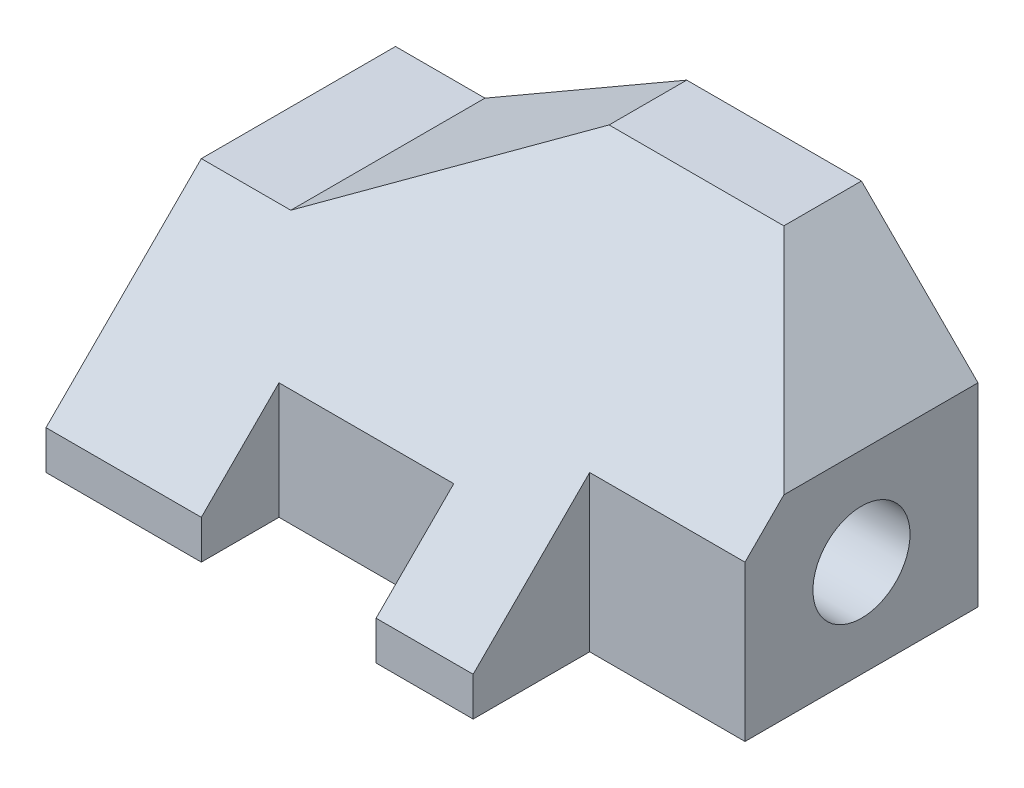
ISO-10303-21;
HEADER;
FILE_DESCRIPTION(('STEP AP214'),'2;1');
FILE_NAME('part.step','',(''),(''),'','','');
FILE_SCHEMA(('AUTOMOTIVE_DESIGN { 1 0 10303 214 1 1 1 1 }'));
ENDSEC;
DATA;
#1=APPLICATION_CONTEXT('core data for automotive mechanical design processes');
#2=APPLICATION_PROTOCOL_DEFINITION('international standard','automotive_design',2000,#1);
#3=PRODUCT_CONTEXT('',#1,'mechanical');
#4=PRODUCT('Part','Part','',(#3));
#5=PRODUCT_RELATED_PRODUCT_CATEGORY('part','',(#4));
#6=PRODUCT_DEFINITION_FORMATION('','',#4);
#7=PRODUCT_DEFINITION_CONTEXT('part definition',#1,'design');
#8=PRODUCT_DEFINITION('design','',#6,#7);
#9=PRODUCT_DEFINITION_SHAPE('','',#8);
#10=(LENGTH_UNIT() NAMED_UNIT(*) SI_UNIT(.MILLI.,.METRE.));
#11=(NAMED_UNIT(*) PLANE_ANGLE_UNIT() SI_UNIT($,.RADIAN.));
#12=(NAMED_UNIT(*) SI_UNIT($,.STERADIAN.) SOLID_ANGLE_UNIT());
#13=UNCERTAINTY_MEASURE_WITH_UNIT(LENGTH_MEASURE(1.E-05),#10,'distance_accuracy_value','');
#14=(GEOMETRIC_REPRESENTATION_CONTEXT(3) GLOBAL_UNCERTAINTY_ASSIGNED_CONTEXT((#13)) GLOBAL_UNIT_ASSIGNED_CONTEXT((#10,
#11,#12)) REPRESENTATION_CONTEXT('',''));
#15=CARTESIAN_POINT('',(0.,0.,0.));
#16=DIRECTION('',(0.,0.,1.));
#17=DIRECTION('',(1.,0.,0.));
#18=AXIS2_PLACEMENT_3D('',#15,#16,#17);
#19=CARTESIAN_POINT('',(0.,50.8,0.));
#20=DIRECTION('',(0.,0.,-1.));
#21=DIRECTION('',(-1.,0.,0.));
#22=AXIS2_PLACEMENT_3D('',#19,#20,#21);
#23=PLANE('',#22);
#24=DIRECTION('',(1.,0.,0.));
#25=VECTOR('',#24,1.);
#26=CARTESIAN_POINT('',(0.,0.,0.));
#27=LINE('',#26,#25);
#28=CARTESIAN_POINT('',(0.,0.,0.));
#29=VERTEX_POINT('',#28);
#30=CARTESIAN_POINT('',(25.4,0.,0.));
#31=VERTEX_POINT('',#30);
#32=EDGE_CURVE('E250',#29,#31,#27,.T.);
#33=ORIENTED_EDGE('',*,*,#32,.T.);
#34=DIRECTION('',(0.,-1.,0.));
#35=VECTOR('',#34,1.);
#36=CARTESIAN_POINT('',(25.4,50.8,0.));
#37=LINE('',#36,#35);
#38=CARTESIAN_POINT('',(25.4,6.35000000000045,0.));
#39=VERTEX_POINT('',#38);
#40=EDGE_CURVE('E194',#39,#31,#37,.T.);
#41=ORIENTED_EDGE('',*,*,#40,.F.);
#42=DIRECTION('',(1.,0.,0.));
#43=VECTOR('',#42,1.);
#44=CARTESIAN_POINT('',(0.,6.35000000000045,0.));
#45=LINE('',#44,#43);
#46=CARTESIAN_POINT('',(0.,6.35000000000045,0.));
#47=VERTEX_POINT('',#46);
#48=EDGE_CURVE('E236',#47,#39,#45,.T.);
#49=ORIENTED_EDGE('',*,*,#48,.F.);
#50=DIRECTION('',(0.,-1.,0.));
#51=VECTOR('',#50,1.);
#52=CARTESIAN_POINT('',(0.,50.8,0.));
#53=LINE('',#52,#51);
#54=EDGE_CURVE('E266',#47,#29,#53,.T.);
#55=ORIENTED_EDGE('',*,*,#54,.T.);
#56=EDGE_LOOP('',(#33,#41,#49,#55));
#57=FACE_BOUND('',#56,.T.);
#58=ADVANCED_FACE('F43',(#57),#23,.F.);
#59=CARTESIAN_POINT('',(0.,50.8,0.));
#60=DIRECTION('',(1.,0.,0.));
#61=DIRECTION('',(0.,0.,-1.));
#62=AXIS2_PLACEMENT_3D('',#59,#60,#61);
#63=PLANE('',#62);
#64=DIRECTION('',(0.,0.707106781186544,-0.707106781186551));
#65=VECTOR('',#64,1.);
#66=CARTESIAN_POINT('',(0.,50.8,-44.45));
#67=LINE('',#66,#65);
#68=CARTESIAN_POINT('',(0.,31.75,-25.3999999999998));
#69=VERTEX_POINT('',#68);
#70=EDGE_CURVE('E225',#47,#69,#67,.T.);
#71=ORIENTED_EDGE('',*,*,#70,.T.);
#72=DIRECTION('',(0.,0.,-1.));
#73=VECTOR('',#72,1.);
#74=CARTESIAN_POINT('',(0.,31.75,0.));
#75=LINE('',#74,#73);
#76=CARTESIAN_POINT('',(0.,31.75,-57.15));
#77=VERTEX_POINT('',#76);
#78=EDGE_CURVE('E174',#69,#77,#75,.T.);
#79=ORIENTED_EDGE('',*,*,#78,.T.);
#80=DIRECTION('',(0.,-1.,0.));
#81=VECTOR('',#80,1.);
#82=CARTESIAN_POINT('',(0.,50.8,-57.15));
#83=LINE('',#82,#81);
#84=CARTESIAN_POINT('',(0.,0.,-57.15));
#85=VERTEX_POINT('',#84);
#86=EDGE_CURVE('E244',#77,#85,#83,.T.);
#87=ORIENTED_EDGE('',*,*,#86,.T.);
#88=DIRECTION('',(0.,0.,1.));
#89=VECTOR('',#88,1.);
#90=CARTESIAN_POINT('',(0.,0.,0.));
#91=LINE('',#90,#89);
#92=EDGE_CURVE('E235',#85,#29,#91,.T.);
#93=ORIENTED_EDGE('',*,*,#92,.T.);
#94=ORIENTED_EDGE('',*,*,#54,.F.);
#95=EDGE_LOOP('',(#71,#79,#87,#93,#94));
#96=FACE_BOUND('',#95,.T.);
#97=ADVANCED_FACE('F321',(#96),#63,.F.);
#98=CARTESIAN_POINT('',(53.975,6.35000000000045,0.));
#99=VERTEX_POINT('',#98);
#100=CARTESIAN_POINT('',(69.85,6.35000000000045,0.));
#101=VERTEX_POINT('',#100);
#102=EDGE_CURVE('E229',#99,#101,#45,.T.);
#103=ORIENTED_EDGE('',*,*,#102,.F.);
#104=DIRECTION('',(0.,-1.,0.));
#105=VECTOR('',#104,1.);
#106=CARTESIAN_POINT('',(53.975,50.8,0.));
#107=LINE('',#106,#105);
#108=CARTESIAN_POINT('',(53.975,0.,0.));
#109=VERTEX_POINT('',#108);
#110=EDGE_CURVE('E198',#99,#109,#107,.T.);
#111=ORIENTED_EDGE('',*,*,#110,.T.);
#112=CARTESIAN_POINT('',(69.85,0.,0.));
#113=VERTEX_POINT('',#112);
#114=EDGE_CURVE('E249',#109,#113,#27,.T.);
#115=ORIENTED_EDGE('',*,*,#114,.T.);
#116=DIRECTION('',(0.,-1.,0.));
#117=VECTOR('',#116,1.);
#118=CARTESIAN_POINT('',(69.85,50.8,0.));
#119=LINE('',#118,#117);
#120=EDGE_CURVE('E214',#101,#113,#119,.T.);
#121=ORIENTED_EDGE('',*,*,#120,.F.);
#122=EDGE_LOOP('',(#103,#111,#115,#121));
#123=FACE_BOUND('',#122,.T.);
#124=ADVANCED_FACE('F345',(#123),#23,.F.);
#125=CARTESIAN_POINT('',(95.25,50.8,0.));
#126=DIRECTION('',(-1.,0.,0.));
#127=DIRECTION('',(0.,0.,1.));
#128=AXIS2_PLACEMENT_3D('',#125,#126,#127);
#129=PLANE('',#128);
#130=CARTESIAN_POINT('',(95.25,15.875,-38.1));
#131=DIRECTION('',(1.,0.,0.));
#132=DIRECTION('',(0.,0.,-1.));
#133=AXIS2_PLACEMENT_3D('',#130,#131,#132);
#134=CIRCLE('',#133,7.9375);
#135=CARTESIAN_POINT('',(95.25,15.875,-46.0375));
#136=VERTEX_POINT('',#135);
#137=EDGE_CURVE('E160',#136,#136,#134,.T.);
#138=ORIENTED_EDGE('',*,*,#137,.F.);
#139=EDGE_LOOP('',(#138));
#140=FACE_BOUND('',#139,.T.);
#141=DIRECTION('',(0.,-1.,0.));
#142=VECTOR('',#141,1.);
#143=CARTESIAN_POINT('',(95.25,50.8,-57.15));
#144=LINE('',#143,#142);
#145=CARTESIAN_POINT('',(95.25,31.7499999999999,-57.15));
#146=VERTEX_POINT('',#145);
#147=CARTESIAN_POINT('',(95.25,0.,-57.15));
#148=VERTEX_POINT('',#147);
#149=EDGE_CURVE('E263',#146,#148,#144,.T.);
#150=ORIENTED_EDGE('',*,*,#149,.F.);
#151=DIRECTION('',(0.,0.,1.));
#152=VECTOR('',#151,1.);
#153=CARTESIAN_POINT('',(95.25,31.7499999999999,0.));
#154=LINE('',#153,#152);
#155=CARTESIAN_POINT('',(95.25,31.7499999999999,-25.3999999999997));
#156=VERTEX_POINT('',#155);
#157=EDGE_CURVE('E67',#146,#156,#154,.T.);
#158=ORIENTED_EDGE('',*,*,#157,.T.);
#159=DIRECTION('',(0.,0.707106781186544,-0.707106781186551));
#160=VECTOR('',#159,1.);
#161=CARTESIAN_POINT('',(95.25,50.8,-44.45));
#162=LINE('',#161,#160);
#163=CARTESIAN_POINT('',(95.25,25.4000000000003,-19.05));
#164=VERTEX_POINT('',#163);
#165=EDGE_CURVE('E218',#164,#156,#162,.T.);
#166=ORIENTED_EDGE('',*,*,#165,.F.);
#167=DIRECTION('',(0.,-1.,0.));
#168=VECTOR('',#167,1.);
#169=CARTESIAN_POINT('',(95.25,50.8,-19.05));
#170=LINE('',#169,#168);
#171=CARTESIAN_POINT('',(95.25,0.,-19.05));
#172=VERTEX_POINT('',#171);
#173=EDGE_CURVE('E219',#164,#172,#170,.T.);
#174=ORIENTED_EDGE('',*,*,#173,.T.);
#175=DIRECTION('',(0.,0.,-1.));
#176=VECTOR('',#175,1.);
#177=CARTESIAN_POINT('',(95.25,0.,0.));
#178=LINE('',#177,#176);
#179=EDGE_CURVE('E254',#172,#148,#178,.T.);
#180=ORIENTED_EDGE('',*,*,#179,.T.);
#181=EDGE_LOOP('',(#150,#158,#166,#174,#180));
#182=FACE_BOUND('',#181,.T.);
#183=ADVANCED_FACE('F441',(#140,#182),#129,.F.);
#184=CARTESIAN_POINT('',(0.,50.8,-57.15));
#185=DIRECTION('',(0.,0.,1.));
#186=DIRECTION('',(1.,0.,0.));
#187=AXIS2_PLACEMENT_3D('',#184,#185,#186);
#188=PLANE('',#187);
#189=ORIENTED_EDGE('',*,*,#86,.F.);
#190=DIRECTION('',(-1.,0.,0.));
#191=VECTOR('',#190,1.);
#192=CARTESIAN_POINT('',(14.6294321158124,31.75,-57.15));
#193=LINE('',#192,#191);
#194=CARTESIAN_POINT('',(14.6294321158124,31.75,-57.15));
#195=VERTEX_POINT('',#194);
#196=EDGE_CURVE('E166',#195,#77,#193,.T.);
#197=ORIENTED_EDGE('',*,*,#196,.F.);
#198=DIRECTION('',(-0.866025403784442,-0.499999999999995,0.));
#199=VECTOR('',#198,1.);
#200=CARTESIAN_POINT('',(47.625,50.8,-57.15));
#201=LINE('',#200,#199);
#202=CARTESIAN_POINT('',(47.625,50.8,-57.15));
#203=VERTEX_POINT('',#202);
#204=EDGE_CURVE('E159',#203,#195,#201,.T.);
#205=ORIENTED_EDGE('',*,*,#204,.F.);
#206=DIRECTION('',(-1.,0.,0.));
#207=VECTOR('',#206,1.);
#208=CARTESIAN_POINT('',(0.,50.8,-57.15));
#209=LINE('',#208,#207);
#210=CARTESIAN_POINT('',(76.2,50.8,-57.15));
#211=VERTEX_POINT('',#210);
#212=EDGE_CURVE('E240',#211,#203,#209,.T.);
#213=ORIENTED_EDGE('',*,*,#212,.F.);
#214=DIRECTION('',(-0.707106781186546,0.707106781186549,0.));
#215=VECTOR('',#214,1.);
#216=CARTESIAN_POINT('',(76.2,50.8,-57.15));
#217=LINE('',#216,#215);
#218=EDGE_CURVE('E293',#211,#146,#217,.F.);
#219=ORIENTED_EDGE('',*,*,#218,.T.);
#220=ORIENTED_EDGE('',*,*,#149,.T.);
#221=DIRECTION('',(-1.,0.,0.));
#222=VECTOR('',#221,1.);
#223=CARTESIAN_POINT('',(0.,0.,-57.15));
#224=LINE('',#223,#222);
#225=EDGE_CURVE('E245',#148,#85,#224,.T.);
#226=ORIENTED_EDGE('',*,*,#225,.T.);
#227=EDGE_LOOP('',(#189,#197,#205,#213,#219,#220,#226));
#228=FACE_BOUND('',#227,.T.);
#229=ADVANCED_FACE('F316',(#228),#188,.F.);
#230=CARTESIAN_POINT('',(0.,50.8,-57.15));
#231=DIRECTION('',(0.,-1.,0.));
#232=DIRECTION('',(0.,0.,-1.));
#233=AXIS2_PLACEMENT_3D('',#230,#231,#232);
#234=PLANE('',#233);
#235=ORIENTED_EDGE('',*,*,#212,.T.);
#236=DIRECTION('',(0.,0.,-1.));
#237=VECTOR('',#236,1.);
#238=CARTESIAN_POINT('',(47.625,50.8,0.));
#239=LINE('',#238,#237);
#240=CARTESIAN_POINT('',(47.625,50.8,-44.45));
#241=VERTEX_POINT('',#240);
#242=EDGE_CURVE('E173',#241,#203,#239,.T.);
#243=ORIENTED_EDGE('',*,*,#242,.F.);
#244=DIRECTION('',(1.,0.,0.));
#245=VECTOR('',#244,1.);
#246=CARTESIAN_POINT('',(0.,50.8,-44.45));
#247=LINE('',#246,#245);
#248=CARTESIAN_POINT('',(76.2,50.8,-44.45));
#249=VERTEX_POINT('',#248);
#250=EDGE_CURVE('E232',#241,#249,#247,.T.);
#251=ORIENTED_EDGE('',*,*,#250,.T.);
#252=DIRECTION('',(0.,0.,-1.));
#253=VECTOR('',#252,1.);
#254=CARTESIAN_POINT('',(76.2,50.8,-57.15));
#255=LINE('',#254,#253);
#256=EDGE_CURVE('E289',#249,#211,#255,.T.);
#257=ORIENTED_EDGE('',*,*,#256,.T.);
#258=EDGE_LOOP('',(#235,#243,#251,#257));
#259=FACE_BOUND('',#258,.T.);
#260=ADVANCED_FACE('F311',(#259),#234,.F.);
#261=CARTESIAN_POINT('',(0.,0.,-57.15));
#262=DIRECTION('',(0.,-1.,0.));
#263=DIRECTION('',(0.,0.,-1.));
#264=AXIS2_PLACEMENT_3D('',#261,#262,#263);
#265=PLANE('',#264);
#266=DIRECTION('',(0.,0.,-1.));
#267=VECTOR('',#266,1.);
#268=CARTESIAN_POINT('',(25.4,0.,0.));
#269=LINE('',#268,#267);
#270=CARTESIAN_POINT('',(25.4,0.,-12.7));
#271=VERTEX_POINT('',#270);
#272=EDGE_CURVE('E178',#31,#271,#269,.T.);
#273=ORIENTED_EDGE('',*,*,#272,.F.);
#274=ORIENTED_EDGE('',*,*,#32,.F.);
#275=ORIENTED_EDGE('',*,*,#92,.F.);
#276=ORIENTED_EDGE('',*,*,#225,.F.);
#277=ORIENTED_EDGE('',*,*,#179,.F.);
#278=DIRECTION('',(1.,0.,0.));
#279=VECTOR('',#278,1.);
#280=CARTESIAN_POINT('',(69.85,0.,-19.05));
#281=LINE('',#280,#279);
#282=CARTESIAN_POINT('',(69.85,0.,-19.05));
#283=VERTEX_POINT('',#282);
#284=EDGE_CURVE('E210',#283,#172,#281,.T.);
#285=ORIENTED_EDGE('',*,*,#284,.F.);
#286=DIRECTION('',(0.,0.,-1.));
#287=VECTOR('',#286,1.);
#288=CARTESIAN_POINT('',(69.85,0.,0.));
#289=LINE('',#288,#287);
#290=EDGE_CURVE('E197',#113,#283,#289,.T.);
#291=ORIENTED_EDGE('',*,*,#290,.F.);
#292=ORIENTED_EDGE('',*,*,#114,.F.);
#293=DIRECTION('',(0.,0.,1.));
#294=VECTOR('',#293,1.);
#295=CARTESIAN_POINT('',(53.975,0.,0.));
#296=LINE('',#295,#294);
#297=CARTESIAN_POINT('',(53.975,0.,-12.7));
#298=VERTEX_POINT('',#297);
#299=EDGE_CURVE('E190',#298,#109,#296,.T.);
#300=ORIENTED_EDGE('',*,*,#299,.F.);
#301=DIRECTION('',(1.,0.,0.));
#302=VECTOR('',#301,1.);
#303=CARTESIAN_POINT('',(25.4,0.,-12.7));
#304=LINE('',#303,#302);
#305=EDGE_CURVE('E186',#271,#298,#304,.T.);
#306=ORIENTED_EDGE('',*,*,#305,.F.);
#307=EDGE_LOOP('',(#273,#274,#275,#276,#277,#285,#291,#292,#300,#306));
#308=FACE_BOUND('',#307,.T.);
#309=ADVANCED_FACE('F333',(#308),#265,.T.);
#310=CARTESIAN_POINT('',(0.,50.8,-44.45));
#311=DIRECTION('',(0.,-0.707106781186551,-0.707106781186544));
#312=DIRECTION('',(0.,0.707106781186544,-0.707106781186551));
#313=AXIS2_PLACEMENT_3D('',#310,#311,#312);
#314=PLANE('',#313);
#315=DIRECTION('',(-0.774596669241486,-0.447213595499953,0.447213595499958));
#316=VECTOR('',#315,1.);
#317=CARTESIAN_POINT('',(19.0499999999998,34.3022160579066,-27.9522160579064));
#318=LINE('',#317,#316);
#319=CARTESIAN_POINT('',(14.6294321158124,31.75,-25.3999999999998));
#320=VERTEX_POINT('',#319);
#321=EDGE_CURVE('E52',#241,#320,#318,.T.);
#322=ORIENTED_EDGE('',*,*,#321,.T.);
#323=DIRECTION('',(-1.,0.,0.));
#324=VECTOR('',#323,1.);
#325=CARTESIAN_POINT('',(0.,31.75,-25.3999999999998));
#326=LINE('',#325,#324);
#327=EDGE_CURVE('E11',#320,#69,#326,.T.);
#328=ORIENTED_EDGE('',*,*,#327,.T.);
#329=ORIENTED_EDGE('',*,*,#70,.F.);
#330=ORIENTED_EDGE('',*,*,#48,.T.);
#331=DIRECTION('',(0.,0.707106781186544,-0.707106781186551));
#332=VECTOR('',#331,1.);
#333=CARTESIAN_POINT('',(25.4,50.8,-44.45));
#334=LINE('',#333,#332);
#335=CARTESIAN_POINT('',(25.4,19.0500000000003,-12.7));
#336=VERTEX_POINT('',#335);
#337=EDGE_CURVE('E285',#39,#336,#334,.T.);
#338=ORIENTED_EDGE('',*,*,#337,.T.);
#339=DIRECTION('',(1.,0.,0.));
#340=VECTOR('',#339,1.);
#341=CARTESIAN_POINT('',(0.,19.0500000000003,-12.7));
#342=LINE('',#341,#340);
#343=CARTESIAN_POINT('',(53.975,19.0500000000003,-12.7));
#344=VERTEX_POINT('',#343);
#345=EDGE_CURVE('E277',#336,#344,#342,.T.);
#346=ORIENTED_EDGE('',*,*,#345,.T.);
#347=DIRECTION('',(0.,-0.707106781186544,0.707106781186551));
#348=VECTOR('',#347,1.);
#349=CARTESIAN_POINT('',(53.975,50.8,-44.45));
#350=LINE('',#349,#348);
#351=EDGE_CURVE('E281',#344,#99,#350,.T.);
#352=ORIENTED_EDGE('',*,*,#351,.T.);
#353=ORIENTED_EDGE('',*,*,#102,.T.);
#354=DIRECTION('',(0.,0.707106781186544,-0.707106781186551));
#355=VECTOR('',#354,1.);
#356=CARTESIAN_POINT('',(69.85,50.8,-44.45));
#357=LINE('',#356,#355);
#358=CARTESIAN_POINT('',(69.85,25.4000000000003,-19.05));
#359=VERTEX_POINT('',#358);
#360=EDGE_CURVE('E273',#101,#359,#357,.T.);
#361=ORIENTED_EDGE('',*,*,#360,.T.);
#362=DIRECTION('',(1.,0.,0.));
#363=VECTOR('',#362,1.);
#364=CARTESIAN_POINT('',(0.,25.4000000000002,-19.05));
#365=LINE('',#364,#363);
#366=EDGE_CURVE('E269',#359,#164,#365,.T.);
#367=ORIENTED_EDGE('',*,*,#366,.T.);
#368=ORIENTED_EDGE('',*,*,#165,.T.);
#369=DIRECTION('',(0.577350269189622,-0.577350269189625,0.577350269189631));
#370=VECTOR('',#369,1.);
#371=CARTESIAN_POINT('',(71.9666666666667,55.0333333333334,-48.6833333333334));
#372=LINE('',#371,#370);
#373=EDGE_CURVE('E298',#156,#249,#372,.F.);
#374=ORIENTED_EDGE('',*,*,#373,.T.);
#375=ORIENTED_EDGE('',*,*,#250,.F.);
#376=EDGE_LOOP('',(#322,#328,#329,#330,#338,#346,#352,#353,#361,#367,#368,#374,#375));
#377=FACE_BOUND('',#376,.T.);
#378=ADVANCED_FACE('F307',(#377),#314,.F.);
#379=CARTESIAN_POINT('',(69.85,50.8,0.));
#380=DIRECTION('',(-1.,0.,0.));
#381=DIRECTION('',(0.,0.,1.));
#382=AXIS2_PLACEMENT_3D('',#379,#380,#381);
#383=PLANE('',#382);
#384=ORIENTED_EDGE('',*,*,#120,.T.);
#385=ORIENTED_EDGE('',*,*,#290,.T.);
#386=DIRECTION('',(0.,-1.,0.));
#387=VECTOR('',#386,1.);
#388=CARTESIAN_POINT('',(69.85,50.8,-19.05));
#389=LINE('',#388,#387);
#390=EDGE_CURVE('E213',#359,#283,#389,.T.);
#391=ORIENTED_EDGE('',*,*,#390,.F.);
#392=ORIENTED_EDGE('',*,*,#360,.F.);
#393=EDGE_LOOP('',(#384,#385,#391,#392));
#394=FACE_BOUND('',#393,.T.);
#395=ADVANCED_FACE('F434',(#394),#383,.F.);
#396=CARTESIAN_POINT('',(69.85,50.8,-19.05));
#397=DIRECTION('',(0.,0.,-1.));
#398=DIRECTION('',(-1.,0.,0.));
#399=AXIS2_PLACEMENT_3D('',#396,#397,#398);
#400=PLANE('',#399);
#401=ORIENTED_EDGE('',*,*,#390,.T.);
#402=ORIENTED_EDGE('',*,*,#284,.T.);
#403=ORIENTED_EDGE('',*,*,#173,.F.);
#404=ORIENTED_EDGE('',*,*,#366,.F.);
#405=EDGE_LOOP('',(#401,#402,#403,#404));
#406=FACE_BOUND('',#405,.T.);
#407=ADVANCED_FACE('F440',(#406),#400,.F.);
#408=CARTESIAN_POINT('',(25.4,50.8,0.));
#409=DIRECTION('',(-1.,0.,0.));
#410=DIRECTION('',(0.,0.,1.));
#411=AXIS2_PLACEMENT_3D('',#408,#409,#410);
#412=PLANE('',#411);
#413=ORIENTED_EDGE('',*,*,#40,.T.);
#414=ORIENTED_EDGE('',*,*,#272,.T.);
#415=DIRECTION('',(0.,-1.,0.));
#416=VECTOR('',#415,1.);
#417=CARTESIAN_POINT('',(25.4,50.8,-12.7));
#418=LINE('',#417,#416);
#419=EDGE_CURVE('E193',#336,#271,#418,.T.);
#420=ORIENTED_EDGE('',*,*,#419,.F.);
#421=ORIENTED_EDGE('',*,*,#337,.F.);
#422=EDGE_LOOP('',(#413,#414,#420,#421));
#423=FACE_BOUND('',#422,.T.);
#424=ADVANCED_FACE('F329',(#423),#412,.F.);
#425=CARTESIAN_POINT('',(53.975,50.8,0.));
#426=DIRECTION('',(1.,0.,0.));
#427=DIRECTION('',(0.,0.,-1.));
#428=AXIS2_PLACEMENT_3D('',#425,#426,#427);
#429=PLANE('',#428);
#430=DIRECTION('',(0.,-1.,0.));
#431=VECTOR('',#430,1.);
#432=CARTESIAN_POINT('',(53.975,50.8,-12.7));
#433=LINE('',#432,#431);
#434=EDGE_CURVE('E202',#344,#298,#433,.T.);
#435=ORIENTED_EDGE('',*,*,#434,.T.);
#436=ORIENTED_EDGE('',*,*,#299,.T.);
#437=ORIENTED_EDGE('',*,*,#110,.F.);
#438=ORIENTED_EDGE('',*,*,#351,.F.);
#439=EDGE_LOOP('',(#435,#436,#437,#438));
#440=FACE_BOUND('',#439,.T.);
#441=ADVANCED_FACE('F450',(#440),#429,.F.);
#442=CARTESIAN_POINT('',(25.4,50.8,-12.7));
#443=DIRECTION('',(0.,0.,-1.));
#444=DIRECTION('',(-1.,0.,0.));
#445=AXIS2_PLACEMENT_3D('',#442,#443,#444);
#446=PLANE('',#445);
#447=ORIENTED_EDGE('',*,*,#419,.T.);
#448=ORIENTED_EDGE('',*,*,#305,.T.);
#449=ORIENTED_EDGE('',*,*,#434,.F.);
#450=ORIENTED_EDGE('',*,*,#345,.F.);
#451=EDGE_LOOP('',(#447,#448,#449,#450));
#452=FACE_BOUND('',#451,.T.);
#453=ADVANCED_FACE('F338',(#452),#446,.F.);
#454=CARTESIAN_POINT('',(76.2,50.8,-57.15));
#455=DIRECTION('',(-0.707106781186549,-0.707106781186546,0.));
#456=DIRECTION('',(0.707106781186546,-0.707106781186549,0.));
#457=AXIS2_PLACEMENT_3D('',#454,#455,#456);
#458=PLANE('',#457);
#459=ORIENTED_EDGE('',*,*,#373,.F.);
#460=ORIENTED_EDGE('',*,*,#157,.F.);
#461=ORIENTED_EDGE('',*,*,#218,.F.);
#462=ORIENTED_EDGE('',*,*,#256,.F.);
#463=EDGE_LOOP('',(#459,#460,#461,#462));
#464=FACE_BOUND('',#463,.T.);
#465=ADVANCED_FACE('F45',(#464),#458,.F.);
#466=CARTESIAN_POINT('',(14.6294321158124,31.75,0.));
#467=DIRECTION('',(0.,-1.,0.));
#468=DIRECTION('',(0.,0.,-1.));
#469=AXIS2_PLACEMENT_3D('',#466,#467,#468);
#470=PLANE('',#469);
#471=DIRECTION('',(0.,0.,-1.));
#472=VECTOR('',#471,1.);
#473=CARTESIAN_POINT('',(14.6294321158124,31.75,0.));
#474=LINE('',#473,#472);
#475=EDGE_CURVE('E59',#320,#195,#474,.T.);
#476=ORIENTED_EDGE('',*,*,#475,.T.);
#477=ORIENTED_EDGE('',*,*,#196,.T.);
#478=ORIENTED_EDGE('',*,*,#78,.F.);
#479=ORIENTED_EDGE('',*,*,#327,.F.);
#480=EDGE_LOOP('',(#476,#477,#478,#479));
#481=FACE_BOUND('',#480,.T.);
#482=ADVANCED_FACE('F319',(#481),#470,.F.);
#483=CARTESIAN_POINT('',(47.625,50.8,0.));
#484=DIRECTION('',(0.499999999999995,-0.866025403784442,0.));
#485=DIRECTION('',(0.866025403784442,0.499999999999995,0.));
#486=AXIS2_PLACEMENT_3D('',#483,#484,#485);
#487=PLANE('',#486);
#488=ORIENTED_EDGE('',*,*,#242,.T.);
#489=ORIENTED_EDGE('',*,*,#204,.T.);
#490=ORIENTED_EDGE('',*,*,#475,.F.);
#491=ORIENTED_EDGE('',*,*,#321,.F.);
#492=EDGE_LOOP('',(#488,#489,#490,#491));
#493=FACE_BOUND('',#492,.T.);
#494=ADVANCED_FACE('F152',(#493),#487,.F.);
#495=CARTESIAN_POINT('',(63.5,15.875,-38.1));
#496=DIRECTION('',(1.,0.,0.));
#497=DIRECTION('',(0.,0.,-1.));
#498=AXIS2_PLACEMENT_3D('',#495,#496,#497);
#499=CONICAL_SURFACE('',#498,7.93749999999999,1.02974425867665);
#500=CARTESIAN_POINT('',(58.7306688364687,15.875,-38.1));
#501=VERTEX_POINT('',#500);
#502=VERTEX_LOOP('',#501);
#503=FACE_BOUND('',#502,.T.);
#504=CARTESIAN_POINT('',(63.5,15.875,-38.1));
#505=DIRECTION('',(1.,0.,0.));
#506=DIRECTION('',(0.,0.,-1.));
#507=AXIS2_PLACEMENT_3D('',#504,#505,#506);
#508=CIRCLE('',#507,7.93749999999999);
#509=CARTESIAN_POINT('',(63.5,15.875,-46.0375));
#510=VERTEX_POINT('',#509);
#511=EDGE_CURVE('E156',#510,#510,#508,.T.);
#512=ORIENTED_EDGE('',*,*,#511,.T.);
#513=EDGE_LOOP('',(#512));
#514=FACE_BOUND('',#513,.T.);
#515=ADVANCED_FACE('F148',(#503,#514),#499,.F.);
#516=CARTESIAN_POINT('',(95.25,15.875,-38.1));
#517=DIRECTION('',(1.,0.,0.));
#518=DIRECTION('',(0.,0.,-1.));
#519=AXIS2_PLACEMENT_3D('',#516,#517,#518);
#520=CYLINDRICAL_SURFACE('',#519,7.93749999999999);
#521=ORIENTED_EDGE('',*,*,#511,.F.);
#522=EDGE_LOOP('',(#521));
#523=FACE_BOUND('',#522,.T.);
#524=ORIENTED_EDGE('',*,*,#137,.T.);
#525=EDGE_LOOP('',(#524));
#526=FACE_BOUND('',#525,.T.);
#527=ADVANCED_FACE('F151',(#523,#526),#520,.F.);
#528=CLOSED_SHELL('',(#58,#97,#124,#183,#229,#260,#309,#378,#395,#407,#424,#441,#453,#465,#482,
#494,#515,#527));
#529=MANIFOLD_SOLID_BREP('B2',#528);
#530=ADVANCED_BREP_SHAPE_REPRESENTATION('',(#18,#529),#14);
#531=SHAPE_DEFINITION_REPRESENTATION(#9,#530);
ENDSEC;
END-ISO-10303-21;
